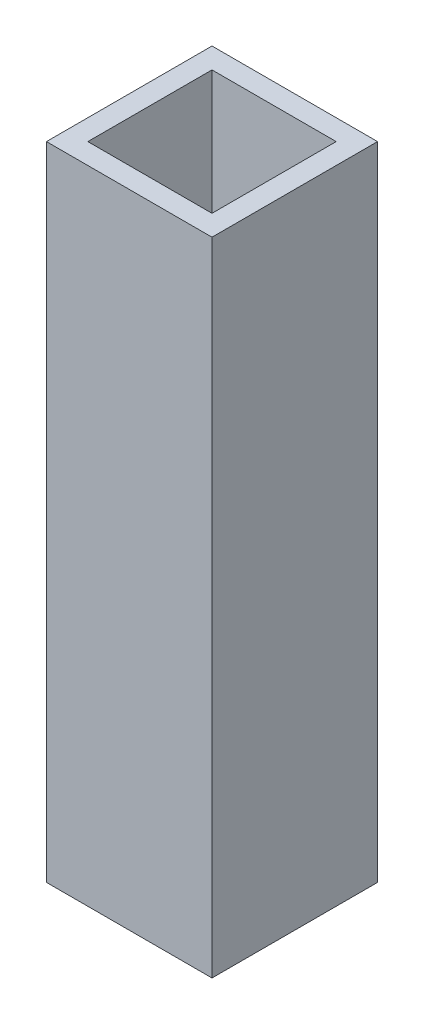
ISO-10303-21;
HEADER;
FILE_DESCRIPTION(('STEP AP214'),'2;1');
FILE_NAME('part.step','',(''),(''),'','','');
FILE_SCHEMA(('AUTOMOTIVE_DESIGN { 1 0 10303 214 1 1 1 1 }'));
ENDSEC;
DATA;
#1=APPLICATION_CONTEXT('core data for automotive mechanical design processes');
#2=APPLICATION_PROTOCOL_DEFINITION('international standard','automotive_design',2000,#1);
#3=PRODUCT_CONTEXT('',#1,'mechanical');
#4=PRODUCT('Part','Part','',(#3));
#5=PRODUCT_RELATED_PRODUCT_CATEGORY('part','',(#4));
#6=PRODUCT_DEFINITION_FORMATION('','',#4);
#7=PRODUCT_DEFINITION_CONTEXT('part definition',#1,'design');
#8=PRODUCT_DEFINITION('design','',#6,#7);
#9=PRODUCT_DEFINITION_SHAPE('','',#8);
#10=(LENGTH_UNIT() NAMED_UNIT(*) SI_UNIT(.MILLI.,.METRE.));
#11=(NAMED_UNIT(*) PLANE_ANGLE_UNIT() SI_UNIT($,.RADIAN.));
#12=(NAMED_UNIT(*) SI_UNIT($,.STERADIAN.) SOLID_ANGLE_UNIT());
#13=UNCERTAINTY_MEASURE_WITH_UNIT(LENGTH_MEASURE(1.E-05),#10,'distance_accuracy_value','');
#14=(GEOMETRIC_REPRESENTATION_CONTEXT(3) GLOBAL_UNCERTAINTY_ASSIGNED_CONTEXT((#13)) GLOBAL_UNIT_ASSIGNED_CONTEXT((#10,
#11,#12)) REPRESENTATION_CONTEXT('',''));
#15=CARTESIAN_POINT('',(0.,0.,0.));
#16=DIRECTION('',(0.,0.,1.));
#17=DIRECTION('',(1.,0.,0.));
#18=AXIS2_PLACEMENT_3D('',#15,#16,#17);
#19=CARTESIAN_POINT('',(0.,98.425,0.));
#20=DIRECTION('',(0.,-1.,0.));
#21=DIRECTION('',(0.,0.,-1.));
#22=AXIS2_PLACEMENT_3D('',#19,#20,#21);
#23=PLANE('',#22);
#24=DIRECTION('',(0.,0.,1.));
#25=VECTOR('',#24,1.);
#26=CARTESIAN_POINT('',(0.,98.425,0.));
#27=LINE('',#26,#25);
#28=CARTESIAN_POINT('',(0.,98.425,-25.4));
#29=VERTEX_POINT('',#28);
#30=CARTESIAN_POINT('',(0.,98.425,0.));
#31=VERTEX_POINT('',#30);
#32=EDGE_CURVE('E134',#29,#31,#27,.T.);
#33=ORIENTED_EDGE('',*,*,#32,.T.);
#34=DIRECTION('',(1.,0.,0.));
#35=VECTOR('',#34,1.);
#36=CARTESIAN_POINT('',(0.,98.425,0.));
#37=LINE('',#36,#35);
#38=CARTESIAN_POINT('',(25.4,98.425,0.));
#39=VERTEX_POINT('',#38);
#40=EDGE_CURVE('E137',#31,#39,#37,.T.);
#41=ORIENTED_EDGE('',*,*,#40,.T.);
#42=DIRECTION('',(0.,0.,-1.));
#43=VECTOR('',#42,1.);
#44=CARTESIAN_POINT('',(25.4,98.425,0.));
#45=LINE('',#44,#43);
#46=CARTESIAN_POINT('',(25.4,98.425,-25.4));
#47=VERTEX_POINT('',#46);
#48=EDGE_CURVE('E140',#39,#47,#45,.T.);
#49=ORIENTED_EDGE('',*,*,#48,.T.);
#50=DIRECTION('',(-1.,0.,0.));
#51=VECTOR('',#50,1.);
#52=CARTESIAN_POINT('',(0.,98.425,-25.4));
#53=LINE('',#52,#51);
#54=EDGE_CURVE('E142',#47,#29,#53,.T.);
#55=ORIENTED_EDGE('',*,*,#54,.T.);
#56=EDGE_LOOP('',(#33,#41,#49,#55));
#57=FACE_BOUND('',#56,.T.);
#58=DIRECTION('',(0.,0.,1.));
#59=VECTOR('',#58,1.);
#60=CARTESIAN_POINT('',(3.175,98.425,-3.175));
#61=LINE('',#60,#59);
#62=CARTESIAN_POINT('',(3.175,98.425,-22.225));
#63=VERTEX_POINT('',#62);
#64=CARTESIAN_POINT('',(3.175,98.425,-3.175));
#65=VERTEX_POINT('',#64);
#66=EDGE_CURVE('E98',#63,#65,#61,.T.);
#67=ORIENTED_EDGE('',*,*,#66,.F.);
#68=DIRECTION('',(-1.,0.,0.));
#69=VECTOR('',#68,1.);
#70=CARTESIAN_POINT('',(3.175,98.425,-22.225));
#71=LINE('',#70,#69);
#72=CARTESIAN_POINT('',(22.225,98.425,-22.225));
#73=VERTEX_POINT('',#72);
#74=EDGE_CURVE('E120',#73,#63,#71,.T.);
#75=ORIENTED_EDGE('',*,*,#74,.F.);
#76=DIRECTION('',(0.,0.,-1.));
#77=VECTOR('',#76,1.);
#78=CARTESIAN_POINT('',(22.225,98.425,-3.175));
#79=LINE('',#78,#77);
#80=CARTESIAN_POINT('',(22.225,98.425,-3.175));
#81=VERTEX_POINT('',#80);
#82=EDGE_CURVE('E118',#81,#73,#79,.T.);
#83=ORIENTED_EDGE('',*,*,#82,.F.);
#84=DIRECTION('',(1.,0.,0.));
#85=VECTOR('',#84,1.);
#86=CARTESIAN_POINT('',(3.175,98.425,-3.175));
#87=LINE('',#86,#85);
#88=EDGE_CURVE('E106',#65,#81,#87,.T.);
#89=ORIENTED_EDGE('',*,*,#88,.F.);
#90=EDGE_LOOP('',(#67,#75,#83,#89));
#91=FACE_BOUND('',#90,.T.);
#92=ADVANCED_FACE('F33',(#57,#91),#23,.F.);
#93=CARTESIAN_POINT('',(0.,0.,0.));
#94=DIRECTION('',(0.,-1.,0.));
#95=DIRECTION('',(0.,0.,-1.));
#96=AXIS2_PLACEMENT_3D('',#93,#94,#95);
#97=PLANE('',#96);
#98=DIRECTION('',(0.,0.,1.));
#99=VECTOR('',#98,1.);
#100=CARTESIAN_POINT('',(0.,0.,0.));
#101=LINE('',#100,#99);
#102=CARTESIAN_POINT('',(0.,0.,-25.4));
#103=VERTEX_POINT('',#102);
#104=CARTESIAN_POINT('',(0.,0.,0.));
#105=VERTEX_POINT('',#104);
#106=EDGE_CURVE('E114',#103,#105,#101,.T.);
#107=ORIENTED_EDGE('',*,*,#106,.F.);
#108=DIRECTION('',(-1.,0.,0.));
#109=VECTOR('',#108,1.);
#110=CARTESIAN_POINT('',(0.,0.,-25.4));
#111=LINE('',#110,#109);
#112=CARTESIAN_POINT('',(25.4,0.,-25.4));
#113=VERTEX_POINT('',#112);
#114=EDGE_CURVE('E138',#113,#103,#111,.T.);
#115=ORIENTED_EDGE('',*,*,#114,.F.);
#116=DIRECTION('',(0.,0.,-1.));
#117=VECTOR('',#116,1.);
#118=CARTESIAN_POINT('',(25.4,0.,0.));
#119=LINE('',#118,#117);
#120=CARTESIAN_POINT('',(25.4,0.,0.));
#121=VERTEX_POINT('',#120);
#122=EDGE_CURVE('E149',#121,#113,#119,.T.);
#123=ORIENTED_EDGE('',*,*,#122,.F.);
#124=DIRECTION('',(1.,0.,0.));
#125=VECTOR('',#124,1.);
#126=CARTESIAN_POINT('',(0.,0.,0.));
#127=LINE('',#126,#125);
#128=EDGE_CURVE('E147',#105,#121,#127,.T.);
#129=ORIENTED_EDGE('',*,*,#128,.F.);
#130=EDGE_LOOP('',(#107,#115,#123,#129));
#131=FACE_BOUND('',#130,.T.);
#132=DIRECTION('',(-1.,0.,0.));
#133=VECTOR('',#132,1.);
#134=CARTESIAN_POINT('',(3.175,0.,-22.225));
#135=LINE('',#134,#133);
#136=CARTESIAN_POINT('',(22.225,0.,-22.225));
#137=VERTEX_POINT('',#136);
#138=CARTESIAN_POINT('',(3.175,0.,-22.225));
#139=VERTEX_POINT('',#138);
#140=EDGE_CURVE('E107',#137,#139,#135,.T.);
#141=ORIENTED_EDGE('',*,*,#140,.T.);
#142=DIRECTION('',(0.,0.,1.));
#143=VECTOR('',#142,1.);
#144=CARTESIAN_POINT('',(3.175,0.,-3.175));
#145=LINE('',#144,#143);
#146=CARTESIAN_POINT('',(3.175,0.,-3.175));
#147=VERTEX_POINT('',#146);
#148=EDGE_CURVE('E56',#139,#147,#145,.T.);
#149=ORIENTED_EDGE('',*,*,#148,.T.);
#150=DIRECTION('',(1.,0.,0.));
#151=VECTOR('',#150,1.);
#152=CARTESIAN_POINT('',(3.175,0.,-3.175));
#153=LINE('',#152,#151);
#154=CARTESIAN_POINT('',(22.225,0.,-3.175));
#155=VERTEX_POINT('',#154);
#156=EDGE_CURVE('E113',#147,#155,#153,.T.);
#157=ORIENTED_EDGE('',*,*,#156,.T.);
#158=DIRECTION('',(0.,0.,-1.));
#159=VECTOR('',#158,1.);
#160=CARTESIAN_POINT('',(22.225,0.,-3.175));
#161=LINE('',#160,#159);
#162=EDGE_CURVE('E126',#155,#137,#161,.T.);
#163=ORIENTED_EDGE('',*,*,#162,.T.);
#164=EDGE_LOOP('',(#141,#149,#157,#163));
#165=FACE_BOUND('',#164,.T.);
#166=ADVANCED_FACE('F167',(#131,#165),#97,.T.);
#167=CARTESIAN_POINT('',(0.,98.425,0.));
#168=DIRECTION('',(1.,0.,0.));
#169=DIRECTION('',(0.,0.,-1.));
#170=AXIS2_PLACEMENT_3D('',#167,#168,#169);
#171=PLANE('',#170);
#172=ORIENTED_EDGE('',*,*,#106,.T.);
#173=DIRECTION('',(0.,-1.,0.));
#174=VECTOR('',#173,1.);
#175=CARTESIAN_POINT('',(0.,98.425,0.));
#176=LINE('',#175,#174);
#177=EDGE_CURVE('E11',#31,#105,#176,.T.);
#178=ORIENTED_EDGE('',*,*,#177,.F.);
#179=ORIENTED_EDGE('',*,*,#32,.F.);
#180=DIRECTION('',(0.,-1.,0.));
#181=VECTOR('',#180,1.);
#182=CARTESIAN_POINT('',(0.,98.425,-25.4));
#183=LINE('',#182,#181);
#184=EDGE_CURVE('E144',#29,#103,#183,.T.);
#185=ORIENTED_EDGE('',*,*,#184,.T.);
#186=EDGE_LOOP('',(#172,#178,#179,#185));
#187=FACE_BOUND('',#186,.T.);
#188=ADVANCED_FACE('F35',(#187),#171,.F.);
#189=CARTESIAN_POINT('',(0.,98.425,0.));
#190=DIRECTION('',(0.,0.,-1.));
#191=DIRECTION('',(-1.,0.,0.));
#192=AXIS2_PLACEMENT_3D('',#189,#190,#191);
#193=PLANE('',#192);
#194=ORIENTED_EDGE('',*,*,#128,.T.);
#195=DIRECTION('',(0.,-1.,0.));
#196=VECTOR('',#195,1.);
#197=CARTESIAN_POINT('',(25.4,98.425,0.));
#198=LINE('',#197,#196);
#199=EDGE_CURVE('E41',#39,#121,#198,.T.);
#200=ORIENTED_EDGE('',*,*,#199,.F.);
#201=ORIENTED_EDGE('',*,*,#40,.F.);
#202=ORIENTED_EDGE('',*,*,#177,.T.);
#203=EDGE_LOOP('',(#194,#200,#201,#202));
#204=FACE_BOUND('',#203,.T.);
#205=ADVANCED_FACE('F177',(#204),#193,.F.);
#206=CARTESIAN_POINT('',(25.4,98.425,0.));
#207=DIRECTION('',(-1.,0.,0.));
#208=DIRECTION('',(0.,0.,1.));
#209=AXIS2_PLACEMENT_3D('',#206,#207,#208);
#210=PLANE('',#209);
#211=ORIENTED_EDGE('',*,*,#122,.T.);
#212=DIRECTION('',(0.,-1.,0.));
#213=VECTOR('',#212,1.);
#214=CARTESIAN_POINT('',(25.4,98.425,-25.4));
#215=LINE('',#214,#213);
#216=EDGE_CURVE('E154',#47,#113,#215,.T.);
#217=ORIENTED_EDGE('',*,*,#216,.F.);
#218=ORIENTED_EDGE('',*,*,#48,.F.);
#219=ORIENTED_EDGE('',*,*,#199,.T.);
#220=EDGE_LOOP('',(#211,#217,#218,#219));
#221=FACE_BOUND('',#220,.T.);
#222=ADVANCED_FACE('F161',(#221),#210,.F.);
#223=CARTESIAN_POINT('',(0.,98.425,-25.4));
#224=DIRECTION('',(0.,0.,1.));
#225=DIRECTION('',(1.,0.,0.));
#226=AXIS2_PLACEMENT_3D('',#223,#224,#225);
#227=PLANE('',#226);
#228=ORIENTED_EDGE('',*,*,#114,.T.);
#229=ORIENTED_EDGE('',*,*,#184,.F.);
#230=ORIENTED_EDGE('',*,*,#54,.F.);
#231=ORIENTED_EDGE('',*,*,#216,.T.);
#232=EDGE_LOOP('',(#228,#229,#230,#231));
#233=FACE_BOUND('',#232,.T.);
#234=ADVANCED_FACE('F171',(#233),#227,.F.);
#235=CARTESIAN_POINT('',(3.175,98.425,-3.175));
#236=DIRECTION('',(1.,0.,0.));
#237=DIRECTION('',(0.,0.,-1.));
#238=AXIS2_PLACEMENT_3D('',#235,#236,#237);
#239=PLANE('',#238);
#240=ORIENTED_EDGE('',*,*,#148,.F.);
#241=DIRECTION('',(0.,-1.,0.));
#242=VECTOR('',#241,1.);
#243=CARTESIAN_POINT('',(3.175,98.425,-22.225));
#244=LINE('',#243,#242);
#245=EDGE_CURVE('E102',#63,#139,#244,.T.);
#246=ORIENTED_EDGE('',*,*,#245,.F.);
#247=ORIENTED_EDGE('',*,*,#66,.T.);
#248=DIRECTION('',(0.,-1.,0.));
#249=VECTOR('',#248,1.);
#250=CARTESIAN_POINT('',(3.175,98.425,-3.175));
#251=LINE('',#250,#249);
#252=EDGE_CURVE('E101',#65,#147,#251,.T.);
#253=ORIENTED_EDGE('',*,*,#252,.T.);
#254=EDGE_LOOP('',(#240,#246,#247,#253));
#255=FACE_BOUND('',#254,.T.);
#256=ADVANCED_FACE('F100',(#255),#239,.T.);
#257=CARTESIAN_POINT('',(3.175,98.425,-3.175));
#258=DIRECTION('',(0.,0.,-1.));
#259=DIRECTION('',(-1.,0.,0.));
#260=AXIS2_PLACEMENT_3D('',#257,#258,#259);
#261=PLANE('',#260);
#262=ORIENTED_EDGE('',*,*,#156,.F.);
#263=ORIENTED_EDGE('',*,*,#252,.F.);
#264=ORIENTED_EDGE('',*,*,#88,.T.);
#265=DIRECTION('',(0.,-1.,0.));
#266=VECTOR('',#265,1.);
#267=CARTESIAN_POINT('',(22.225,98.425,-3.175));
#268=LINE('',#267,#266);
#269=EDGE_CURVE('E115',#81,#155,#268,.T.);
#270=ORIENTED_EDGE('',*,*,#269,.T.);
#271=EDGE_LOOP('',(#262,#263,#264,#270));
#272=FACE_BOUND('',#271,.T.);
#273=ADVANCED_FACE('F110',(#272),#261,.T.);
#274=CARTESIAN_POINT('',(22.225,98.425,-3.175));
#275=DIRECTION('',(-1.,0.,0.));
#276=DIRECTION('',(0.,0.,1.));
#277=AXIS2_PLACEMENT_3D('',#274,#275,#276);
#278=PLANE('',#277);
#279=ORIENTED_EDGE('',*,*,#162,.F.);
#280=ORIENTED_EDGE('',*,*,#269,.F.);
#281=ORIENTED_EDGE('',*,*,#82,.T.);
#282=DIRECTION('',(0.,-1.,0.));
#283=VECTOR('',#282,1.);
#284=CARTESIAN_POINT('',(22.225,98.425,-22.225));
#285=LINE('',#284,#283);
#286=EDGE_CURVE('E48',#73,#137,#285,.T.);
#287=ORIENTED_EDGE('',*,*,#286,.T.);
#288=EDGE_LOOP('',(#279,#280,#281,#287));
#289=FACE_BOUND('',#288,.T.);
#290=ADVANCED_FACE('F200',(#289),#278,.T.);
#291=CARTESIAN_POINT('',(3.175,98.425,-22.225));
#292=DIRECTION('',(0.,0.,1.));
#293=DIRECTION('',(1.,0.,0.));
#294=AXIS2_PLACEMENT_3D('',#291,#292,#293);
#295=PLANE('',#294);
#296=ORIENTED_EDGE('',*,*,#140,.F.);
#297=ORIENTED_EDGE('',*,*,#286,.F.);
#298=ORIENTED_EDGE('',*,*,#74,.T.);
#299=ORIENTED_EDGE('',*,*,#245,.T.);
#300=EDGE_LOOP('',(#296,#297,#298,#299));
#301=FACE_BOUND('',#300,.T.);
#302=ADVANCED_FACE('F204',(#301),#295,.T.);
#303=CLOSED_SHELL('',(#92,#166,#188,#205,#222,#234,#256,#273,#290,#302));
#304=MANIFOLD_SOLID_BREP('B2',#303);
#305=ADVANCED_BREP_SHAPE_REPRESENTATION('',(#18,#304),#14);
#306=SHAPE_DEFINITION_REPRESENTATION(#9,#305);
ENDSEC;
END-ISO-10303-21;
